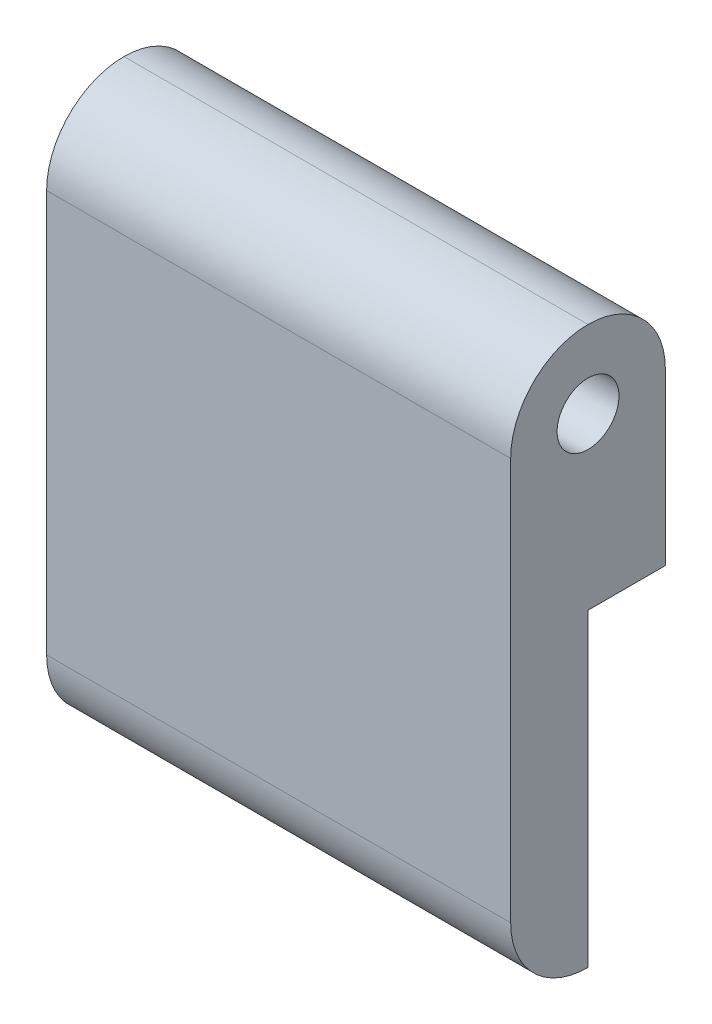
ISO-10303-21;
HEADER;
FILE_DESCRIPTION(('STEP AP214'),'2;1');
FILE_NAME('part.step','',(''),(''),'','','');
FILE_SCHEMA(('AUTOMOTIVE_DESIGN { 1 0 10303 214 1 1 1 1 }'));
ENDSEC;
DATA;
#1=APPLICATION_CONTEXT('core data for automotive mechanical design processes');
#2=APPLICATION_PROTOCOL_DEFINITION('international standard','automotive_design',2000,#1);
#3=PRODUCT_CONTEXT('',#1,'mechanical');
#4=PRODUCT('Part','Part','',(#3));
#5=PRODUCT_RELATED_PRODUCT_CATEGORY('part','',(#4));
#6=PRODUCT_DEFINITION_FORMATION('','',#4);
#7=PRODUCT_DEFINITION_CONTEXT('part definition',#1,'design');
#8=PRODUCT_DEFINITION('design','',#6,#7);
#9=PRODUCT_DEFINITION_SHAPE('','',#8);
#10=(LENGTH_UNIT() NAMED_UNIT(*) SI_UNIT(.MILLI.,.METRE.));
#11=(NAMED_UNIT(*) PLANE_ANGLE_UNIT() SI_UNIT($,.RADIAN.));
#12=(NAMED_UNIT(*) SI_UNIT($,.STERADIAN.) SOLID_ANGLE_UNIT());
#13=UNCERTAINTY_MEASURE_WITH_UNIT(LENGTH_MEASURE(1.E-05),#10,'distance_accuracy_value','');
#14=(GEOMETRIC_REPRESENTATION_CONTEXT(3) GLOBAL_UNCERTAINTY_ASSIGNED_CONTEXT((#13)) GLOBAL_UNIT_ASSIGNED_CONTEXT((#10,
#11,#12)) REPRESENTATION_CONTEXT('',''));
#15=CARTESIAN_POINT('',(0.,0.,0.));
#16=DIRECTION('',(0.,0.,1.));
#17=DIRECTION('',(1.,0.,0.));
#18=AXIS2_PLACEMENT_3D('',#15,#16,#17);
#19=CARTESIAN_POINT('',(-7.5,-4.,5.));
#20=DIRECTION('',(0.,1.,0.));
#21=DIRECTION('',(0.,0.,1.));
#22=AXIS2_PLACEMENT_3D('',#19,#20,#21);
#23=PLANE('',#22);
#24=DIRECTION('',(1.,0.,0.));
#25=VECTOR('',#24,1.);
#26=CARTESIAN_POINT('',(7.5,-4.,2.5));
#27=LINE('',#26,#25);
#28=CARTESIAN_POINT('',(-7.5,-4.,2.5));
#29=VERTEX_POINT('',#28);
#30=CARTESIAN_POINT('',(7.5,-4.,2.5));
#31=VERTEX_POINT('',#30);
#32=EDGE_CURVE('E119',#29,#31,#27,.T.);
#33=ORIENTED_EDGE('',*,*,#32,.F.);
#34=DIRECTION('',(0.,0.,-1.));
#35=VECTOR('',#34,1.);
#36=CARTESIAN_POINT('',(-7.5,-4.,5.));
#37=LINE('',#36,#35);
#38=CARTESIAN_POINT('',(-7.5,-4.,0.));
#39=VERTEX_POINT('',#38);
#40=EDGE_CURVE('E110',#29,#39,#37,.T.);
#41=ORIENTED_EDGE('',*,*,#40,.T.);
#42=DIRECTION('',(1.,0.,0.));
#43=VECTOR('',#42,1.);
#44=CARTESIAN_POINT('',(-7.5,-4.,0.));
#45=LINE('',#44,#43);
#46=CARTESIAN_POINT('',(7.5,-4.,0.));
#47=VERTEX_POINT('',#46);
#48=EDGE_CURVE('E155',#39,#47,#45,.T.);
#49=ORIENTED_EDGE('',*,*,#48,.T.);
#50=DIRECTION('',(0.,0.,-1.));
#51=VECTOR('',#50,1.);
#52=CARTESIAN_POINT('',(7.5,-4.,5.));
#53=LINE('',#52,#51);
#54=EDGE_CURVE('E156',#31,#47,#53,.T.);
#55=ORIENTED_EDGE('',*,*,#54,.F.);
#56=EDGE_LOOP('',(#33,#41,#49,#55));
#57=FACE_BOUND('',#56,.T.);
#58=ADVANCED_FACE('F33',(#57),#23,.F.);
#59=CARTESIAN_POINT('',(7.5,-4.,5.));
#60=DIRECTION('',(-1.,0.,0.));
#61=DIRECTION('',(0.,0.,1.));
#62=AXIS2_PLACEMENT_3D('',#59,#60,#61);
#63=PLANE('',#62);
#64=CARTESIAN_POINT('',(7.5,1.5,2.5));
#65=DIRECTION('',(1.,0.,0.));
#66=DIRECTION('',(0.,0.,-1.));
#67=AXIS2_PLACEMENT_3D('',#64,#65,#66);
#68=CIRCLE('',#67,1.);
#69=CARTESIAN_POINT('',(7.5,1.5,1.5));
#70=VERTEX_POINT('',#69);
#71=EDGE_CURVE('E126',#70,#70,#68,.T.);
#72=ORIENTED_EDGE('',*,*,#71,.F.);
#73=EDGE_LOOP('',(#72));
#74=FACE_BOUND('',#73,.T.);
#75=DIRECTION('',(0.,1.,0.));
#76=VECTOR('',#75,1.);
#77=CARTESIAN_POINT('',(7.5,-4.,5.));
#78=LINE('',#77,#76);
#79=CARTESIAN_POINT('',(7.5,-11.5,5.));
#80=VERTEX_POINT('',#79);
#81=CARTESIAN_POINT('',(7.5,1.5,5.));
#82=VERTEX_POINT('',#81);
#83=EDGE_CURVE('E129',#80,#82,#78,.T.);
#84=ORIENTED_EDGE('',*,*,#83,.F.);
#85=CARTESIAN_POINT('',(7.5,-11.5,2.5));
#86=DIRECTION('',(-1.,0.,0.));
#87=DIRECTION('',(0.,0.,1.));
#88=AXIS2_PLACEMENT_3D('',#85,#86,#87);
#89=CIRCLE('',#88,2.5);
#90=CARTESIAN_POINT('',(7.5,-14.,2.5));
#91=VERTEX_POINT('',#90);
#92=EDGE_CURVE('E42',#80,#91,#89,.F.);
#93=ORIENTED_EDGE('',*,*,#92,.T.);
#94=DIRECTION('',(0.,1.,0.));
#95=VECTOR('',#94,1.);
#96=CARTESIAN_POINT('',(7.5,-14.,2.5));
#97=LINE('',#96,#95);
#98=EDGE_CURVE('E114',#91,#31,#97,.T.);
#99=ORIENTED_EDGE('',*,*,#98,.T.);
#100=ORIENTED_EDGE('',*,*,#54,.T.);
#101=DIRECTION('',(0.,1.,0.));
#102=VECTOR('',#101,1.);
#103=CARTESIAN_POINT('',(7.5,-4.,0.));
#104=LINE('',#103,#102);
#105=CARTESIAN_POINT('',(7.5,1.5,0.));
#106=VERTEX_POINT('',#105);
#107=EDGE_CURVE('E113',#47,#106,#104,.T.);
#108=ORIENTED_EDGE('',*,*,#107,.T.);
#109=CARTESIAN_POINT('',(7.5,1.5,2.5));
#110=DIRECTION('',(-1.,0.,0.));
#111=DIRECTION('',(0.,0.,1.));
#112=AXIS2_PLACEMENT_3D('',#109,#110,#111);
#113=CIRCLE('',#112,2.5);
#114=CARTESIAN_POINT('',(7.5,4.,2.5));
#115=VERTEX_POINT('',#114);
#116=EDGE_CURVE('E49',#106,#115,#113,.F.);
#117=ORIENTED_EDGE('',*,*,#116,.T.);
#118=CARTESIAN_POINT('',(7.5,1.5,2.5));
#119=DIRECTION('',(-1.,0.,0.));
#120=DIRECTION('',(0.,0.,1.));
#121=AXIS2_PLACEMENT_3D('',#118,#119,#120);
#122=CIRCLE('',#121,2.5);
#123=EDGE_CURVE('E146',#115,#82,#122,.F.);
#124=ORIENTED_EDGE('',*,*,#123,.T.);
#125=EDGE_LOOP('',(#84,#93,#99,#100,#108,#117,#124));
#126=FACE_BOUND('',#125,.T.);
#127=ADVANCED_FACE('F150',(#74,#126),#63,.F.);
#128=CARTESIAN_POINT('',(-7.5,-4.,5.));
#129=DIRECTION('',(1.,0.,0.));
#130=DIRECTION('',(0.,0.,-1.));
#131=AXIS2_PLACEMENT_3D('',#128,#129,#130);
#132=PLANE('',#131);
#133=CARTESIAN_POINT('',(-7.5,1.5,2.5));
#134=DIRECTION('',(1.,0.,0.));
#135=DIRECTION('',(0.,0.,-1.));
#136=AXIS2_PLACEMENT_3D('',#133,#134,#135);
#137=CIRCLE('',#136,1.);
#138=CARTESIAN_POINT('',(-7.5,1.5,1.5));
#139=VERTEX_POINT('',#138);
#140=EDGE_CURVE('E122',#139,#139,#137,.T.);
#141=ORIENTED_EDGE('',*,*,#140,.T.);
#142=EDGE_LOOP('',(#141));
#143=FACE_BOUND('',#142,.T.);
#144=DIRECTION('',(0.,1.,0.));
#145=VECTOR('',#144,1.);
#146=CARTESIAN_POINT('',(-7.5,-14.,2.5));
#147=LINE('',#146,#145);
#148=CARTESIAN_POINT('',(-7.5,-14.,2.5));
#149=VERTEX_POINT('',#148);
#150=EDGE_CURVE('E107',#149,#29,#147,.T.);
#151=ORIENTED_EDGE('',*,*,#150,.F.);
#152=CARTESIAN_POINT('',(-7.5,-11.5,2.5));
#153=DIRECTION('',(1.,0.,0.));
#154=DIRECTION('',(0.,0.,-1.));
#155=AXIS2_PLACEMENT_3D('',#152,#153,#154);
#156=CIRCLE('',#155,2.5);
#157=CARTESIAN_POINT('',(-7.5,-11.5,5.));
#158=VERTEX_POINT('',#157);
#159=EDGE_CURVE('E92',#149,#158,#156,.F.);
#160=ORIENTED_EDGE('',*,*,#159,.T.);
#161=DIRECTION('',(0.,-1.,0.));
#162=VECTOR('',#161,1.);
#163=CARTESIAN_POINT('',(-7.5,-4.,5.));
#164=LINE('',#163,#162);
#165=CARTESIAN_POINT('',(-7.5,1.5,5.));
#166=VERTEX_POINT('',#165);
#167=EDGE_CURVE('E154',#166,#158,#164,.T.);
#168=ORIENTED_EDGE('',*,*,#167,.F.);
#169=CARTESIAN_POINT('',(-7.5,1.5,2.5));
#170=DIRECTION('',(1.,0.,0.));
#171=DIRECTION('',(0.,0.,-1.));
#172=AXIS2_PLACEMENT_3D('',#169,#170,#171);
#173=CIRCLE('',#172,2.5);
#174=CARTESIAN_POINT('',(-7.5,4.,2.5));
#175=VERTEX_POINT('',#174);
#176=EDGE_CURVE('E141',#166,#175,#173,.F.);
#177=ORIENTED_EDGE('',*,*,#176,.T.);
#178=CARTESIAN_POINT('',(-7.5,1.5,2.5));
#179=DIRECTION('',(1.,0.,0.));
#180=DIRECTION('',(0.,0.,-1.));
#181=AXIS2_PLACEMENT_3D('',#178,#179,#180);
#182=CIRCLE('',#181,2.5);
#183=CARTESIAN_POINT('',(-7.5,1.5,0.));
#184=VERTEX_POINT('',#183);
#185=EDGE_CURVE('E103',#175,#184,#182,.F.);
#186=ORIENTED_EDGE('',*,*,#185,.T.);
#187=DIRECTION('',(0.,-1.,0.));
#188=VECTOR('',#187,1.);
#189=CARTESIAN_POINT('',(-7.5,-4.,0.));
#190=LINE('',#189,#188);
#191=EDGE_CURVE('E158',#184,#39,#190,.T.);
#192=ORIENTED_EDGE('',*,*,#191,.T.);
#193=ORIENTED_EDGE('',*,*,#40,.F.);
#194=EDGE_LOOP('',(#151,#160,#168,#177,#186,#192,#193));
#195=FACE_BOUND('',#194,.T.);
#196=ADVANCED_FACE('F108',(#143,#195),#132,.F.);
#197=CARTESIAN_POINT('',(0.,0.,5.));
#198=DIRECTION('',(0.,0.,-1.));
#199=DIRECTION('',(-1.,0.,0.));
#200=AXIS2_PLACEMENT_3D('',#197,#198,#199);
#201=PLANE('',#200);
#202=ORIENTED_EDGE('',*,*,#167,.T.);
#203=DIRECTION('',(-1.,0.,0.));
#204=VECTOR('',#203,1.);
#205=CARTESIAN_POINT('',(7.5,-11.5,5.));
#206=LINE('',#205,#204);
#207=EDGE_CURVE('E98',#158,#80,#206,.F.);
#208=ORIENTED_EDGE('',*,*,#207,.T.);
#209=ORIENTED_EDGE('',*,*,#83,.T.);
#210=DIRECTION('',(-1.,0.,0.));
#211=VECTOR('',#210,1.);
#212=CARTESIAN_POINT('',(0.,1.5,5.));
#213=LINE('',#212,#211);
#214=EDGE_CURVE('E102',#82,#166,#213,.T.);
#215=ORIENTED_EDGE('',*,*,#214,.T.);
#216=EDGE_LOOP('',(#202,#208,#209,#215));
#217=FACE_BOUND('',#216,.T.);
#218=ADVANCED_FACE('F188',(#217),#201,.F.);
#219=CARTESIAN_POINT('',(0.,0.,0.));
#220=DIRECTION('',(0.,0.,-1.));
#221=DIRECTION('',(-1.,0.,0.));
#222=AXIS2_PLACEMENT_3D('',#219,#220,#221);
#223=PLANE('',#222);
#224=ORIENTED_EDGE('',*,*,#191,.F.);
#225=DIRECTION('',(-1.,0.,0.));
#226=VECTOR('',#225,1.);
#227=CARTESIAN_POINT('',(7.5,1.5,0.));
#228=LINE('',#227,#226);
#229=EDGE_CURVE('E11',#184,#106,#228,.F.);
#230=ORIENTED_EDGE('',*,*,#229,.T.);
#231=ORIENTED_EDGE('',*,*,#107,.F.);
#232=ORIENTED_EDGE('',*,*,#48,.F.);
#233=EDGE_LOOP('',(#224,#230,#231,#232));
#234=FACE_BOUND('',#233,.T.);
#235=ADVANCED_FACE('F170',(#234),#223,.T.);
#236=CARTESIAN_POINT('',(7.5,-14.,2.5));
#237=DIRECTION('',(0.,0.,1.));
#238=DIRECTION('',(1.,0.,0.));
#239=AXIS2_PLACEMENT_3D('',#236,#237,#238);
#240=PLANE('',#239);
#241=ORIENTED_EDGE('',*,*,#32,.T.);
#242=ORIENTED_EDGE('',*,*,#98,.F.);
#243=DIRECTION('',(1.,0.,0.));
#244=VECTOR('',#243,1.);
#245=CARTESIAN_POINT('',(7.5,-14.,2.5));
#246=LINE('',#245,#244);
#247=EDGE_CURVE('E97',#149,#91,#246,.T.);
#248=ORIENTED_EDGE('',*,*,#247,.F.);
#249=ORIENTED_EDGE('',*,*,#150,.T.);
#250=EDGE_LOOP('',(#241,#242,#248,#249));
#251=FACE_BOUND('',#250,.T.);
#252=ADVANCED_FACE('F117',(#251),#240,.F.);
#253=CARTESIAN_POINT('',(-7.50005,1.5,2.5));
#254=DIRECTION('',(1.,0.,0.));
#255=DIRECTION('',(0.,0.,-1.));
#256=AXIS2_PLACEMENT_3D('',#253,#254,#255);
#257=CYLINDRICAL_SURFACE('',#256,1.);
#258=ORIENTED_EDGE('',*,*,#71,.T.);
#259=EDGE_LOOP('',(#258));
#260=FACE_BOUND('',#259,.T.);
#261=ORIENTED_EDGE('',*,*,#140,.F.);
#262=EDGE_LOOP('',(#261));
#263=FACE_BOUND('',#262,.T.);
#264=ADVANCED_FACE('F179',(#260,#263),#257,.F.);
#265=CARTESIAN_POINT('',(0.,-11.5,2.5));
#266=DIRECTION('',(1.,0.,0.));
#267=DIRECTION('',(0.,0.,-1.));
#268=AXIS2_PLACEMENT_3D('',#265,#266,#267);
#269=CYLINDRICAL_SURFACE('',#268,2.5);
#270=ORIENTED_EDGE('',*,*,#92,.F.);
#271=ORIENTED_EDGE('',*,*,#207,.F.);
#272=ORIENTED_EDGE('',*,*,#159,.F.);
#273=ORIENTED_EDGE('',*,*,#247,.T.);
#274=EDGE_LOOP('',(#270,#271,#272,#273));
#275=FACE_BOUND('',#274,.T.);
#276=ADVANCED_FACE('F95',(#275),#269,.T.);
#277=CARTESIAN_POINT('',(0.,1.5,2.5));
#278=DIRECTION('',(-1.,0.,0.));
#279=DIRECTION('',(0.,0.,1.));
#280=AXIS2_PLACEMENT_3D('',#277,#278,#279);
#281=CYLINDRICAL_SURFACE('',#280,2.5);
#282=ORIENTED_EDGE('',*,*,#214,.F.);
#283=ORIENTED_EDGE('',*,*,#123,.F.);
#284=DIRECTION('',(-1.,0.,0.));
#285=VECTOR('',#284,1.);
#286=CARTESIAN_POINT('',(-7.5,4.,2.5));
#287=LINE('',#286,#285);
#288=EDGE_CURVE('E37',#175,#115,#287,.F.);
#289=ORIENTED_EDGE('',*,*,#288,.F.);
#290=ORIENTED_EDGE('',*,*,#176,.F.);
#291=EDGE_LOOP('',(#282,#283,#289,#290));
#292=FACE_BOUND('',#291,.T.);
#293=ADVANCED_FACE('F35',(#292),#281,.T.);
#294=CARTESIAN_POINT('',(-7.5,1.5,2.5));
#295=DIRECTION('',(1.,0.,0.));
#296=DIRECTION('',(0.,0.,-1.));
#297=AXIS2_PLACEMENT_3D('',#294,#295,#296);
#298=CYLINDRICAL_SURFACE('',#297,2.5);
#299=ORIENTED_EDGE('',*,*,#116,.F.);
#300=ORIENTED_EDGE('',*,*,#229,.F.);
#301=ORIENTED_EDGE('',*,*,#185,.F.);
#302=ORIENTED_EDGE('',*,*,#288,.T.);
#303=EDGE_LOOP('',(#299,#300,#301,#302));
#304=FACE_BOUND('',#303,.T.);
#305=ADVANCED_FACE('F172',(#304),#298,.T.);
#306=CLOSED_SHELL('',(#58,#127,#196,#218,#235,#252,#264,#276,#293,#305));
#307=MANIFOLD_SOLID_BREP('B2',#306);
#308=ADVANCED_BREP_SHAPE_REPRESENTATION('',(#18,#307),#14);
#309=SHAPE_DEFINITION_REPRESENTATION(#9,#308);
ENDSEC;
END-ISO-10303-21;
